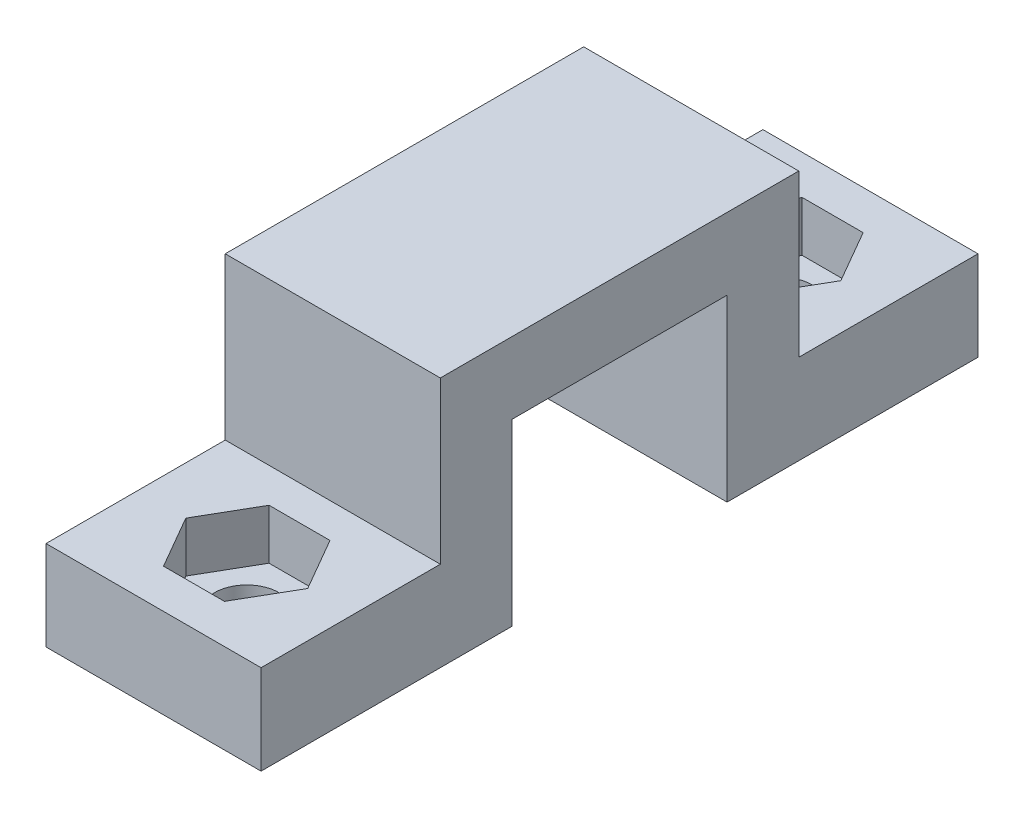
ISO-10303-21;
HEADER;
FILE_DESCRIPTION(('STEP AP214'),'2;1');
FILE_NAME('part.step','',(''),(''),'','','');
FILE_SCHEMA(('AUTOMOTIVE_DESIGN { 1 0 10303 214 1 1 1 1 }'));
ENDSEC;
DATA;
#1=APPLICATION_CONTEXT('core data for automotive mechanical design processes');
#2=APPLICATION_PROTOCOL_DEFINITION('international standard','automotive_design',2000,#1);
#3=PRODUCT_CONTEXT('',#1,'mechanical');
#4=PRODUCT('Part','Part','',(#3));
#5=PRODUCT_RELATED_PRODUCT_CATEGORY('part','',(#4));
#6=PRODUCT_DEFINITION_FORMATION('','',#4);
#7=PRODUCT_DEFINITION_CONTEXT('part definition',#1,'design');
#8=PRODUCT_DEFINITION('design','',#6,#7);
#9=PRODUCT_DEFINITION_SHAPE('','',#8);
#10=(LENGTH_UNIT() NAMED_UNIT(*) SI_UNIT(.MILLI.,.METRE.));
#11=(NAMED_UNIT(*) PLANE_ANGLE_UNIT() SI_UNIT($,.RADIAN.));
#12=(NAMED_UNIT(*) SI_UNIT($,.STERADIAN.) SOLID_ANGLE_UNIT());
#13=UNCERTAINTY_MEASURE_WITH_UNIT(LENGTH_MEASURE(1.E-05),#10,'distance_accuracy_value','');
#14=(GEOMETRIC_REPRESENTATION_CONTEXT(3) GLOBAL_UNCERTAINTY_ASSIGNED_CONTEXT((#13)) GLOBAL_UNIT_ASSIGNED_CONTEXT((#10,
#11,#12)) REPRESENTATION_CONTEXT('',''));
#15=CARTESIAN_POINT('',(0.,0.,0.));
#16=DIRECTION('',(0.,0.,1.));
#17=DIRECTION('',(1.,0.,0.));
#18=AXIS2_PLACEMENT_3D('',#15,#16,#17);
#19=CARTESIAN_POINT('',(0.0735964008141648,0.,14.8725279945104));
#20=DIRECTION('',(0.,1.,0.));
#21=DIRECTION('',(-1.,0.,0.));
#22=AXIS2_PLACEMENT_3D('',#19,#20,#21);
#23=CYLINDRICAL_SURFACE('',#22,1.8);
#24=CARTESIAN_POINT('',(0.0735964008141648,0.,14.8725279945104));
#25=DIRECTION('',(0.,1.,0.));
#26=DIRECTION('',(-1.,0.,0.));
#27=AXIS2_PLACEMENT_3D('',#24,#25,#26);
#28=CIRCLE('',#27,1.8);
#29=CARTESIAN_POINT('',(-1.72640359918583,0.,14.8725279945104));
#30=VERTEX_POINT('',#29);
#31=EDGE_CURVE('E287',#30,#30,#28,.F.);
#32=ORIENTED_EDGE('',*,*,#31,.T.);
#33=EDGE_LOOP('',(#32));
#34=FACE_BOUND('',#33,.T.);
#35=CARTESIAN_POINT('',(0.0735964008141644,2.2,14.8725279945104));
#36=DIRECTION('',(0.,1.,0.));
#37=DIRECTION('',(-1.,0.,0.));
#38=AXIS2_PLACEMENT_3D('',#35,#36,#37);
#39=CIRCLE('',#38,1.8);
#40=CARTESIAN_POINT('',(-1.72640359918584,2.2,14.8725279945104));
#41=VERTEX_POINT('',#40);
#42=EDGE_CURVE('E216',#41,#41,#39,.F.);
#43=ORIENTED_EDGE('',*,*,#42,.F.);
#44=EDGE_LOOP('',(#43));
#45=FACE_BOUND('',#44,.T.);
#46=ADVANCED_FACE('F32',(#34,#45),#23,.F.);
#47=CARTESIAN_POINT('',(6.,5.,-20.));
#48=DIRECTION('',(0.,1.,0.));
#49=DIRECTION('',(-1.,0.,0.));
#50=AXIS2_PLACEMENT_3D('',#47,#48,#49);
#51=PLANE('',#50);
#52=DIRECTION('',(-1.,0.,0.));
#53=VECTOR('',#52,1.);
#54=CARTESIAN_POINT('',(6.,5.,-10.));
#55=LINE('',#54,#53);
#56=CARTESIAN_POINT('',(6.,5.,-10.));
#57=VERTEX_POINT('',#56);
#58=CARTESIAN_POINT('',(-6.,5.,-10.));
#59=VERTEX_POINT('',#58);
#60=EDGE_CURVE('E335',#57,#59,#55,.T.);
#61=ORIENTED_EDGE('',*,*,#60,.F.);
#62=DIRECTION('',(0.,0.,1.));
#63=VECTOR('',#62,1.);
#64=CARTESIAN_POINT('',(6.,5.,-20.));
#65=LINE('',#64,#63);
#66=CARTESIAN_POINT('',(6.,5.,-20.));
#67=VERTEX_POINT('',#66);
#68=EDGE_CURVE('E337',#67,#57,#65,.T.);
#69=ORIENTED_EDGE('',*,*,#68,.F.);
#70=DIRECTION('',(-1.,0.,0.));
#71=VECTOR('',#70,1.);
#72=CARTESIAN_POINT('',(6.,5.,-20.));
#73=LINE('',#72,#71);
#74=CARTESIAN_POINT('',(-6.,5.,-20.));
#75=VERTEX_POINT('',#74);
#76=EDGE_CURVE('E323',#67,#75,#73,.T.);
#77=ORIENTED_EDGE('',*,*,#76,.T.);
#78=DIRECTION('',(0.,0.,1.));
#79=VECTOR('',#78,1.);
#80=CARTESIAN_POINT('',(-6.,5.,-20.));
#81=LINE('',#80,#79);
#82=EDGE_CURVE('E333',#75,#59,#81,.T.);
#83=ORIENTED_EDGE('',*,*,#82,.T.);
#84=EDGE_LOOP('',(#61,#69,#77,#83));
#85=FACE_BOUND('',#84,.T.);
#86=DIRECTION('',(-0.500000000000004,0.,0.866025403784436));
#87=VECTOR('',#86,1.);
#88=CARTESIAN_POINT('',(-3.83479623026002,5.,-2.21402063582801));
#89=LINE('',#88,#87);
#90=CARTESIAN_POINT('',(3.47359640081417,5.,-14.8725279945104));
#91=VERTEX_POINT('',#90);
#92=CARTESIAN_POINT('',(1.77359640081416,5.,-11.9280416216433));
#93=VERTEX_POINT('',#92);
#94=EDGE_CURVE('E271',#91,#93,#89,.T.);
#95=ORIENTED_EDGE('',*,*,#94,.T.);
#96=DIRECTION('',(-1.,0.,0.));
#97=VECTOR('',#96,1.);
#98=CARTESIAN_POINT('',(0.,5.,-11.9280416216433));
#99=LINE('',#98,#97);
#100=CARTESIAN_POINT('',(-1.62640359918585,5.,-11.9280416216433));
#101=VERTEX_POINT('',#100);
#102=EDGE_CURVE('E55',#93,#101,#99,.T.);
#103=ORIENTED_EDGE('',*,*,#102,.T.);
#104=DIRECTION('',(-0.499999999999998,0.,-0.86602540378444));
#105=VECTOR('',#104,1.);
#106=CARTESIAN_POINT('',(3.9451908314812,5.,-2.27775698856011));
#107=LINE('',#106,#105);
#108=CARTESIAN_POINT('',(-3.32640359918584,5.,-14.8725279945104));
#109=VERTEX_POINT('',#108);
#110=EDGE_CURVE('E256',#101,#109,#107,.T.);
#111=ORIENTED_EDGE('',*,*,#110,.T.);
#112=DIRECTION('',(0.500000000000004,0.,-0.866025403784437));
#113=VECTOR('',#112,1.);
#114=CARTESIAN_POINT('',(-8.93479623026,5.,-5.15850700869512));
#115=LINE('',#114,#113);
#116=CARTESIAN_POINT('',(-1.62640359918582,5.,-17.8170143673775));
#117=VERTEX_POINT('',#116);
#118=EDGE_CURVE('E280',#109,#117,#115,.T.);
#119=ORIENTED_EDGE('',*,*,#118,.T.);
#120=DIRECTION('',(1.,0.,0.));
#121=VECTOR('',#120,1.);
#122=CARTESIAN_POINT('',(0.,5.,-17.8170143673775));
#123=LINE('',#122,#121);
#124=CARTESIAN_POINT('',(1.77359640081418,5.,-17.8170143673775));
#125=VERTEX_POINT('',#124);
#126=EDGE_CURVE('E277',#117,#125,#123,.T.);
#127=ORIENTED_EDGE('',*,*,#126,.T.);
#128=DIRECTION('',(0.499999999999998,0.,0.86602540378444));
#129=VECTOR('',#128,1.);
#130=CARTESIAN_POINT('',(9.04519083148122,5.,-5.22224336142719));
#131=LINE('',#130,#129);
#132=EDGE_CURVE('E274',#125,#91,#131,.T.);
#133=ORIENTED_EDGE('',*,*,#132,.T.);
#134=EDGE_LOOP('',(#95,#103,#111,#119,#127,#133));
#135=FACE_BOUND('',#134,.T.);
#136=ADVANCED_FACE('F432',(#85,#135),#51,.T.);
#137=CARTESIAN_POINT('',(0.0735964008141648,0.,-14.8725279945104));
#138=DIRECTION('',(0.,1.,0.));
#139=DIRECTION('',(-1.,0.,0.));
#140=AXIS2_PLACEMENT_3D('',#137,#138,#139);
#141=CYLINDRICAL_SURFACE('',#140,1.8);
#142=CARTESIAN_POINT('',(0.0735964008141648,0.,-14.8725279945104));
#143=DIRECTION('',(0.,1.,0.));
#144=DIRECTION('',(-1.,0.,0.));
#145=AXIS2_PLACEMENT_3D('',#142,#143,#144);
#146=CIRCLE('',#145,1.8);
#147=CARTESIAN_POINT('',(-1.72640359918583,0.,-14.8725279945104));
#148=VERTEX_POINT('',#147);
#149=EDGE_CURVE('E299',#148,#148,#146,.T.);
#150=ORIENTED_EDGE('',*,*,#149,.F.);
#151=EDGE_LOOP('',(#150));
#152=FACE_BOUND('',#151,.T.);
#153=CARTESIAN_POINT('',(0.0735964008141644,2.2,-14.8725279945104));
#154=DIRECTION('',(0.,1.,0.));
#155=DIRECTION('',(-1.,0.,0.));
#156=AXIS2_PLACEMENT_3D('',#153,#154,#155);
#157=CIRCLE('',#156,1.8);
#158=CARTESIAN_POINT('',(-1.72640359918584,2.2,-14.8725279945104));
#159=VERTEX_POINT('',#158);
#160=EDGE_CURVE('E266',#159,#159,#157,.T.);
#161=ORIENTED_EDGE('',*,*,#160,.T.);
#162=EDGE_LOOP('',(#161));
#163=FACE_BOUND('',#162,.T.);
#164=ADVANCED_FACE('F458',(#152,#163),#141,.F.);
#165=CARTESIAN_POINT('',(0.,0.,0.));
#166=DIRECTION('',(0.,1.,0.));
#167=DIRECTION('',(0.,0.,1.));
#168=AXIS2_PLACEMENT_3D('',#165,#166,#167);
#169=PLANE('',#168);
#170=ORIENTED_EDGE('',*,*,#31,.F.);
#171=EDGE_LOOP('',(#170));
#172=FACE_BOUND('',#171,.T.);
#173=DIRECTION('',(0.,0.,1.));
#174=VECTOR('',#173,1.);
#175=CARTESIAN_POINT('',(-6.,0.,10.));
#176=LINE('',#175,#174);
#177=CARTESIAN_POINT('',(-6.,0.,6.00000000000011));
#178=VERTEX_POINT('',#177);
#179=CARTESIAN_POINT('',(-6.00000000000011,0.,20.));
#180=VERTEX_POINT('',#179);
#181=EDGE_CURVE('E362',#178,#180,#176,.T.);
#182=ORIENTED_EDGE('',*,*,#181,.F.);
#183=DIRECTION('',(1.,0.,0.));
#184=VECTOR('',#183,1.);
#185=CARTESIAN_POINT('',(-6.,0.,6.00000000000011));
#186=LINE('',#185,#184);
#187=CARTESIAN_POINT('',(6.,0.,6.00000000000011));
#188=VERTEX_POINT('',#187);
#189=EDGE_CURVE('E302',#178,#188,#186,.T.);
#190=ORIENTED_EDGE('',*,*,#189,.T.);
#191=DIRECTION('',(0.,0.,-1.));
#192=VECTOR('',#191,1.);
#193=CARTESIAN_POINT('',(6.,0.,10.));
#194=LINE('',#193,#192);
#195=CARTESIAN_POINT('',(6.,0.,20.));
#196=VERTEX_POINT('',#195);
#197=EDGE_CURVE('E369',#196,#188,#194,.T.);
#198=ORIENTED_EDGE('',*,*,#197,.F.);
#199=DIRECTION('',(1.,0.,0.));
#200=VECTOR('',#199,1.);
#201=CARTESIAN_POINT('',(6.,0.,20.));
#202=LINE('',#201,#200);
#203=EDGE_CURVE('E317',#180,#196,#202,.T.);
#204=ORIENTED_EDGE('',*,*,#203,.F.);
#205=EDGE_LOOP('',(#182,#190,#198,#204));
#206=FACE_BOUND('',#205,.T.);
#207=ADVANCED_FACE('F408',(#172,#206),#169,.F.);
#208=CARTESIAN_POINT('',(-6.,14.,10.));
#209=DIRECTION('',(1.,0.,0.));
#210=DIRECTION('',(0.,0.,-1.));
#211=AXIS2_PLACEMENT_3D('',#208,#209,#210);
#212=PLANE('',#211);
#213=DIRECTION('',(0.,-1.,0.));
#214=VECTOR('',#213,1.);
#215=CARTESIAN_POINT('',(-6.,9.99999999999545,6.00000000000011));
#216=LINE('',#215,#214);
#217=CARTESIAN_POINT('',(-6.,9.99999999999545,6.00000000000011));
#218=VERTEX_POINT('',#217);
#219=EDGE_CURVE('E346',#218,#178,#216,.T.);
#220=ORIENTED_EDGE('',*,*,#219,.T.);
#221=ORIENTED_EDGE('',*,*,#181,.T.);
#222=DIRECTION('',(0.,-1.,0.));
#223=VECTOR('',#222,1.);
#224=CARTESIAN_POINT('',(-6.00000000000011,0.,20.));
#225=LINE('',#224,#223);
#226=CARTESIAN_POINT('',(-6.,5.,20.));
#227=VERTEX_POINT('',#226);
#228=EDGE_CURVE('E314',#227,#180,#225,.T.);
#229=ORIENTED_EDGE('',*,*,#228,.F.);
#230=CARTESIAN_POINT('',(-6.,5.,10.));
#231=VERTEX_POINT('',#230);
#232=EDGE_CURVE('E336',#231,#227,#81,.T.);
#233=ORIENTED_EDGE('',*,*,#232,.F.);
#234=DIRECTION('',(0.,-1.,0.));
#235=VECTOR('',#234,1.);
#236=CARTESIAN_POINT('',(-6.,14.,10.));
#237=LINE('',#236,#235);
#238=CARTESIAN_POINT('',(-6.,14.,10.));
#239=VERTEX_POINT('',#238);
#240=EDGE_CURVE('E11',#239,#231,#237,.T.);
#241=ORIENTED_EDGE('',*,*,#240,.F.);
#242=DIRECTION('',(0.,0.,1.));
#243=VECTOR('',#242,1.);
#244=CARTESIAN_POINT('',(-6.,14.,10.));
#245=LINE('',#244,#243);
#246=CARTESIAN_POINT('',(-6.,14.,-10.));
#247=VERTEX_POINT('',#246);
#248=EDGE_CURVE('E365',#247,#239,#245,.T.);
#249=ORIENTED_EDGE('',*,*,#248,.F.);
#250=DIRECTION('',(0.,-1.,0.));
#251=VECTOR('',#250,1.);
#252=CARTESIAN_POINT('',(-6.,14.,-10.));
#253=LINE('',#252,#251);
#254=EDGE_CURVE('E375',#247,#59,#253,.T.);
#255=ORIENTED_EDGE('',*,*,#254,.T.);
#256=ORIENTED_EDGE('',*,*,#82,.F.);
#257=DIRECTION('',(0.,-1.,0.));
#258=VECTOR('',#257,1.);
#259=CARTESIAN_POINT('',(-6.00000000000011,0.,-20.));
#260=LINE('',#259,#258);
#261=CARTESIAN_POINT('',(-6.00000000000011,0.,-20.));
#262=VERTEX_POINT('',#261);
#263=EDGE_CURVE('E326',#75,#262,#260,.T.);
#264=ORIENTED_EDGE('',*,*,#263,.T.);
#265=CARTESIAN_POINT('',(-6.,0.,-6.00000000000001));
#266=VERTEX_POINT('',#265);
#267=EDGE_CURVE('E376',#262,#266,#176,.T.);
#268=ORIENTED_EDGE('',*,*,#267,.T.);
#269=DIRECTION('',(0.,1.,0.));
#270=VECTOR('',#269,1.);
#271=CARTESIAN_POINT('',(-6.,9.99999999999545,-6.00000000000001));
#272=LINE('',#271,#270);
#273=CARTESIAN_POINT('',(-6.,9.99999999999545,-6.00000000000001));
#274=VERTEX_POINT('',#273);
#275=EDGE_CURVE('E348',#266,#274,#272,.T.);
#276=ORIENTED_EDGE('',*,*,#275,.T.);
#277=DIRECTION('',(0.,0.,1.));
#278=VECTOR('',#277,1.);
#279=CARTESIAN_POINT('',(-6.,9.99999999999545,6.00000000000011));
#280=LINE('',#279,#278);
#281=EDGE_CURVE('E351',#274,#218,#280,.T.);
#282=ORIENTED_EDGE('',*,*,#281,.T.);
#283=EDGE_LOOP('',(#220,#221,#229,#233,#241,#249,#255,#256,#264,#268,#276,#282));
#284=FACE_BOUND('',#283,.T.);
#285=ADVANCED_FACE('F34',(#284),#212,.F.);
#286=CARTESIAN_POINT('',(6.,14.,10.));
#287=DIRECTION('',(0.,0.,-1.));
#288=DIRECTION('',(-1.,0.,0.));
#289=AXIS2_PLACEMENT_3D('',#286,#287,#288);
#290=PLANE('',#289);
#291=ORIENTED_EDGE('',*,*,#240,.T.);
#292=DIRECTION('',(1.,0.,0.));
#293=VECTOR('',#292,1.);
#294=CARTESIAN_POINT('',(6.,5.,10.));
#295=LINE('',#294,#293);
#296=CARTESIAN_POINT('',(6.,5.,10.));
#297=VERTEX_POINT('',#296);
#298=EDGE_CURVE('E342',#231,#297,#295,.T.);
#299=ORIENTED_EDGE('',*,*,#298,.T.);
#300=DIRECTION('',(0.,-1.,0.));
#301=VECTOR('',#300,1.);
#302=CARTESIAN_POINT('',(6.,14.,10.));
#303=LINE('',#302,#301);
#304=CARTESIAN_POINT('',(6.,14.,10.));
#305=VERTEX_POINT('',#304);
#306=EDGE_CURVE('E40',#305,#297,#303,.T.);
#307=ORIENTED_EDGE('',*,*,#306,.F.);
#308=DIRECTION('',(1.,0.,0.));
#309=VECTOR('',#308,1.);
#310=CARTESIAN_POINT('',(6.,14.,10.));
#311=LINE('',#310,#309);
#312=EDGE_CURVE('E368',#239,#305,#311,.T.);
#313=ORIENTED_EDGE('',*,*,#312,.F.);
#314=EDGE_LOOP('',(#291,#299,#307,#313));
#315=FACE_BOUND('',#314,.T.);
#316=ADVANCED_FACE('F395',(#315),#290,.F.);
#317=CARTESIAN_POINT('',(6.,14.,10.));
#318=DIRECTION('',(-1.,0.,0.));
#319=DIRECTION('',(0.,0.,1.));
#320=AXIS2_PLACEMENT_3D('',#317,#318,#319);
#321=PLANE('',#320);
#322=ORIENTED_EDGE('',*,*,#197,.T.);
#323=DIRECTION('',(0.,-1.,0.));
#324=VECTOR('',#323,1.);
#325=CARTESIAN_POINT('',(6.,9.99999999999545,6.00000000000011));
#326=LINE('',#325,#324);
#327=CARTESIAN_POINT('',(6.,9.99999999999545,6.00000000000011));
#328=VERTEX_POINT('',#327);
#329=EDGE_CURVE('E345',#328,#188,#326,.T.);
#330=ORIENTED_EDGE('',*,*,#329,.F.);
#331=DIRECTION('',(0.,0.,1.));
#332=VECTOR('',#331,1.);
#333=CARTESIAN_POINT('',(6.,9.99999999999545,6.00000000000011));
#334=LINE('',#333,#332);
#335=CARTESIAN_POINT('',(6.,9.99999999999545,-6.00000000000001));
#336=VERTEX_POINT('',#335);
#337=EDGE_CURVE('E349',#336,#328,#334,.T.);
#338=ORIENTED_EDGE('',*,*,#337,.F.);
#339=DIRECTION('',(0.,1.,0.));
#340=VECTOR('',#339,1.);
#341=CARTESIAN_POINT('',(6.,9.99999999999545,-6.00000000000001));
#342=LINE('',#341,#340);
#343=CARTESIAN_POINT('',(6.,0.,-6.00000000000001));
#344=VERTEX_POINT('',#343);
#345=EDGE_CURVE('E356',#344,#336,#342,.T.);
#346=ORIENTED_EDGE('',*,*,#345,.F.);
#347=CARTESIAN_POINT('',(6.,0.,-20.));
#348=VERTEX_POINT('',#347);
#349=EDGE_CURVE('E379',#344,#348,#194,.T.);
#350=ORIENTED_EDGE('',*,*,#349,.T.);
#351=DIRECTION('',(0.,1.,0.));
#352=VECTOR('',#351,1.);
#353=CARTESIAN_POINT('',(6.,0.,-20.));
#354=LINE('',#353,#352);
#355=EDGE_CURVE('E320',#348,#67,#354,.T.);
#356=ORIENTED_EDGE('',*,*,#355,.T.);
#357=ORIENTED_EDGE('',*,*,#68,.T.);
#358=DIRECTION('',(0.,-1.,0.));
#359=VECTOR('',#358,1.);
#360=CARTESIAN_POINT('',(6.,14.,-10.));
#361=LINE('',#360,#359);
#362=CARTESIAN_POINT('',(6.,14.,-10.));
#363=VERTEX_POINT('',#362);
#364=EDGE_CURVE('E384',#363,#57,#361,.T.);
#365=ORIENTED_EDGE('',*,*,#364,.F.);
#366=DIRECTION('',(0.,0.,-1.));
#367=VECTOR('',#366,1.);
#368=CARTESIAN_POINT('',(6.,14.,10.));
#369=LINE('',#368,#367);
#370=EDGE_CURVE('E371',#305,#363,#369,.T.);
#371=ORIENTED_EDGE('',*,*,#370,.F.);
#372=ORIENTED_EDGE('',*,*,#306,.T.);
#373=CARTESIAN_POINT('',(6.,5.,20.));
#374=VERTEX_POINT('',#373);
#375=EDGE_CURVE('E332',#297,#374,#65,.T.);
#376=ORIENTED_EDGE('',*,*,#375,.T.);
#377=DIRECTION('',(0.,1.,0.));
#378=VECTOR('',#377,1.);
#379=CARTESIAN_POINT('',(6.,0.,20.));
#380=LINE('',#379,#378);
#381=EDGE_CURVE('E306',#196,#374,#380,.T.);
#382=ORIENTED_EDGE('',*,*,#381,.F.);
#383=EDGE_LOOP('',(#322,#330,#338,#346,#350,#356,#357,#365,#371,#372,#376,#382));
#384=FACE_BOUND('',#383,.T.);
#385=ADVANCED_FACE('F390',(#384),#321,.F.);
#386=CARTESIAN_POINT('',(6.,14.,-10.));
#387=DIRECTION('',(0.,0.,1.));
#388=DIRECTION('',(1.,0.,0.));
#389=AXIS2_PLACEMENT_3D('',#386,#387,#388);
#390=PLANE('',#389);
#391=ORIENTED_EDGE('',*,*,#364,.T.);
#392=ORIENTED_EDGE('',*,*,#60,.T.);
#393=ORIENTED_EDGE('',*,*,#254,.F.);
#394=DIRECTION('',(-1.,0.,0.));
#395=VECTOR('',#394,1.);
#396=CARTESIAN_POINT('',(6.,14.,-10.));
#397=LINE('',#396,#395);
#398=EDGE_CURVE('E373',#363,#247,#397,.T.);
#399=ORIENTED_EDGE('',*,*,#398,.F.);
#400=EDGE_LOOP('',(#391,#392,#393,#399));
#401=FACE_BOUND('',#400,.T.);
#402=ADVANCED_FACE('F436',(#401),#390,.F.);
#403=CARTESIAN_POINT('',(0.,14.,0.));
#404=DIRECTION('',(0.,1.,0.));
#405=DIRECTION('',(0.,0.,1.));
#406=AXIS2_PLACEMENT_3D('',#403,#404,#405);
#407=PLANE('',#406);
#408=ORIENTED_EDGE('',*,*,#248,.T.);
#409=ORIENTED_EDGE('',*,*,#312,.T.);
#410=ORIENTED_EDGE('',*,*,#370,.T.);
#411=ORIENTED_EDGE('',*,*,#398,.T.);
#412=EDGE_LOOP('',(#408,#409,#410,#411));
#413=FACE_BOUND('',#412,.T.);
#414=ADVANCED_FACE('F439',(#413),#407,.T.);
#415=ORIENTED_EDGE('',*,*,#149,.T.);
#416=EDGE_LOOP('',(#415));
#417=FACE_BOUND('',#416,.T.);
#418=ORIENTED_EDGE('',*,*,#349,.F.);
#419=DIRECTION('',(1.,0.,0.));
#420=VECTOR('',#419,1.);
#421=CARTESIAN_POINT('',(-6.,0.,-6.00000000000001));
#422=LINE('',#421,#420);
#423=EDGE_CURVE('E303',#266,#344,#422,.T.);
#424=ORIENTED_EDGE('',*,*,#423,.F.);
#425=ORIENTED_EDGE('',*,*,#267,.F.);
#426=DIRECTION('',(1.,0.,0.));
#427=VECTOR('',#426,1.);
#428=CARTESIAN_POINT('',(6.,0.,-20.));
#429=LINE('',#428,#427);
#430=EDGE_CURVE('E329',#262,#348,#429,.T.);
#431=ORIENTED_EDGE('',*,*,#430,.T.);
#432=EDGE_LOOP('',(#418,#424,#425,#431));
#433=FACE_BOUND('',#432,.T.);
#434=ADVANCED_FACE('F430',(#417,#433),#169,.F.);
#435=CARTESIAN_POINT('',(-6.,9.99999999999545,6.00000000000011));
#436=DIRECTION('',(0.,0.,1.));
#437=DIRECTION('',(1.,0.,0.));
#438=AXIS2_PLACEMENT_3D('',#435,#436,#437);
#439=PLANE('',#438);
#440=ORIENTED_EDGE('',*,*,#329,.T.);
#441=ORIENTED_EDGE('',*,*,#189,.F.);
#442=ORIENTED_EDGE('',*,*,#219,.F.);
#443=DIRECTION('',(1.,0.,0.));
#444=VECTOR('',#443,1.);
#445=CARTESIAN_POINT('',(-6.,9.99999999999545,6.00000000000011));
#446=LINE('',#445,#444);
#447=EDGE_CURVE('E360',#218,#328,#446,.T.);
#448=ORIENTED_EDGE('',*,*,#447,.T.);
#449=EDGE_LOOP('',(#440,#441,#442,#448));
#450=FACE_BOUND('',#449,.T.);
#451=ADVANCED_FACE('F413',(#450),#439,.F.);
#452=CARTESIAN_POINT('',(-6.,9.99999999999545,6.00000000000011));
#453=DIRECTION('',(0.,1.,0.));
#454=DIRECTION('',(0.,0.,1.));
#455=AXIS2_PLACEMENT_3D('',#452,#453,#454);
#456=PLANE('',#455);
#457=ORIENTED_EDGE('',*,*,#337,.T.);
#458=ORIENTED_EDGE('',*,*,#447,.F.);
#459=ORIENTED_EDGE('',*,*,#281,.F.);
#460=DIRECTION('',(1.,0.,0.));
#461=VECTOR('',#460,1.);
#462=CARTESIAN_POINT('',(-6.,9.99999999999545,-6.00000000000001));
#463=LINE('',#462,#461);
#464=EDGE_CURVE('E354',#274,#336,#463,.T.);
#465=ORIENTED_EDGE('',*,*,#464,.T.);
#466=EDGE_LOOP('',(#457,#458,#459,#465));
#467=FACE_BOUND('',#466,.T.);
#468=ADVANCED_FACE('F417',(#467),#456,.F.);
#469=CARTESIAN_POINT('',(-6.,9.99999999999545,-6.00000000000001));
#470=DIRECTION('',(0.,0.,-1.));
#471=DIRECTION('',(-1.,0.,0.));
#472=AXIS2_PLACEMENT_3D('',#469,#470,#471);
#473=PLANE('',#472);
#474=ORIENTED_EDGE('',*,*,#275,.F.);
#475=ORIENTED_EDGE('',*,*,#423,.T.);
#476=ORIENTED_EDGE('',*,*,#345,.T.);
#477=ORIENTED_EDGE('',*,*,#464,.F.);
#478=EDGE_LOOP('',(#474,#475,#476,#477));
#479=FACE_BOUND('',#478,.T.);
#480=ADVANCED_FACE('F420',(#479),#473,.F.);
#481=CARTESIAN_POINT('',(0.,0.,-20.));
#482=DIRECTION('',(0.,0.,1.));
#483=DIRECTION('',(1.,0.,0.));
#484=AXIS2_PLACEMENT_3D('',#481,#482,#483);
#485=PLANE('',#484);
#486=ORIENTED_EDGE('',*,*,#355,.F.);
#487=ORIENTED_EDGE('',*,*,#430,.F.);
#488=ORIENTED_EDGE('',*,*,#263,.F.);
#489=ORIENTED_EDGE('',*,*,#76,.F.);
#490=EDGE_LOOP('',(#486,#487,#488,#489));
#491=FACE_BOUND('',#490,.T.);
#492=ADVANCED_FACE('F428',(#491),#485,.F.);
#493=DIRECTION('',(0.500000000000003,0.,0.866025403784437));
#494=VECTOR('',#493,1.);
#495=CARTESIAN_POINT('',(-8.93479623026,5.,5.15850700869511));
#496=LINE('',#495,#494);
#497=CARTESIAN_POINT('',(-3.32640359918584,5.,14.8725279945104));
#498=VERTEX_POINT('',#497);
#499=CARTESIAN_POINT('',(-1.62640359918583,5.,17.8170143673775));
#500=VERTEX_POINT('',#499);
#501=EDGE_CURVE('E47',#498,#500,#496,.T.);
#502=ORIENTED_EDGE('',*,*,#501,.F.);
#503=DIRECTION('',(-0.499999999999998,0.,0.86602540378444));
#504=VECTOR('',#503,1.);
#505=CARTESIAN_POINT('',(3.9451908314812,5.,2.27775698856011));
#506=LINE('',#505,#504);
#507=CARTESIAN_POINT('',(-1.62640359918585,5.,11.9280416216433));
#508=VERTEX_POINT('',#507);
#509=EDGE_CURVE('E219',#508,#498,#506,.T.);
#510=ORIENTED_EDGE('',*,*,#509,.F.);
#511=DIRECTION('',(-1.,0.,0.));
#512=VECTOR('',#511,1.);
#513=CARTESIAN_POINT('',(0.,5.,11.9280416216433));
#514=LINE('',#513,#512);
#515=CARTESIAN_POINT('',(1.77359640081415,5.,11.9280416216433));
#516=VERTEX_POINT('',#515);
#517=EDGE_CURVE('E238',#516,#508,#514,.T.);
#518=ORIENTED_EDGE('',*,*,#517,.F.);
#519=DIRECTION('',(-0.500000000000004,0.,-0.866025403784436));
#520=VECTOR('',#519,1.);
#521=CARTESIAN_POINT('',(-3.83479623026003,5.,2.21402063582801));
#522=LINE('',#521,#520);
#523=CARTESIAN_POINT('',(3.47359640081417,5.,14.8725279945104));
#524=VERTEX_POINT('',#523);
#525=EDGE_CURVE('E235',#524,#516,#522,.T.);
#526=ORIENTED_EDGE('',*,*,#525,.F.);
#527=DIRECTION('',(0.499999999999998,0.,-0.86602540378444));
#528=VECTOR('',#527,1.);
#529=CARTESIAN_POINT('',(9.04519083148122,5.,5.22224336142719));
#530=LINE('',#529,#528);
#531=CARTESIAN_POINT('',(1.77359640081417,5.,17.8170143673775));
#532=VERTEX_POINT('',#531);
#533=EDGE_CURVE('E232',#532,#524,#530,.T.);
#534=ORIENTED_EDGE('',*,*,#533,.F.);
#535=DIRECTION('',(1.,0.,0.));
#536=VECTOR('',#535,1.);
#537=CARTESIAN_POINT('',(0.,5.,17.8170143673775));
#538=LINE('',#537,#536);
#539=EDGE_CURVE('E230',#500,#532,#538,.T.);
#540=ORIENTED_EDGE('',*,*,#539,.F.);
#541=EDGE_LOOP('',(#502,#510,#518,#526,#534,#540));
#542=FACE_BOUND('',#541,.T.);
#543=ORIENTED_EDGE('',*,*,#298,.F.);
#544=ORIENTED_EDGE('',*,*,#232,.T.);
#545=DIRECTION('',(-1.,0.,0.));
#546=VECTOR('',#545,1.);
#547=CARTESIAN_POINT('',(6.,5.,20.));
#548=LINE('',#547,#546);
#549=EDGE_CURVE('E311',#374,#227,#548,.T.);
#550=ORIENTED_EDGE('',*,*,#549,.F.);
#551=ORIENTED_EDGE('',*,*,#375,.F.);
#552=EDGE_LOOP('',(#543,#544,#550,#551));
#553=FACE_BOUND('',#552,.T.);
#554=ADVANCED_FACE('F399',(#542,#553),#51,.T.);
#555=CARTESIAN_POINT('',(0.,0.,20.));
#556=DIRECTION('',(0.,0.,1.));
#557=DIRECTION('',(1.,0.,0.));
#558=AXIS2_PLACEMENT_3D('',#555,#556,#557);
#559=PLANE('',#558);
#560=ORIENTED_EDGE('',*,*,#381,.T.);
#561=ORIENTED_EDGE('',*,*,#549,.T.);
#562=ORIENTED_EDGE('',*,*,#228,.T.);
#563=ORIENTED_EDGE('',*,*,#203,.T.);
#564=EDGE_LOOP('',(#560,#561,#562,#563));
#565=FACE_BOUND('',#564,.T.);
#566=ADVANCED_FACE('F406',(#565),#559,.T.);
#567=CARTESIAN_POINT('',(0.,2.2,-11.9280416216433));
#568=DIRECTION('',(0.,0.,-1.));
#569=DIRECTION('',(-1.,0.,0.));
#570=AXIS2_PLACEMENT_3D('',#567,#568,#569);
#571=PLANE('',#570);
#572=ORIENTED_EDGE('',*,*,#102,.F.);
#573=DIRECTION('',(0.,1.,0.));
#574=VECTOR('',#573,1.);
#575=CARTESIAN_POINT('',(1.77359640081416,2.2,-11.9280416216433));
#576=LINE('',#575,#574);
#577=CARTESIAN_POINT('',(1.77359640081416,2.2,-11.9280416216433));
#578=VERTEX_POINT('',#577);
#579=EDGE_CURVE('E269',#578,#93,#576,.T.);
#580=ORIENTED_EDGE('',*,*,#579,.F.);
#581=DIRECTION('',(-1.,0.,0.));
#582=VECTOR('',#581,1.);
#583=CARTESIAN_POINT('',(0.,2.2,-11.9280416216433));
#584=LINE('',#583,#582);
#585=CARTESIAN_POINT('',(-1.62640359918584,2.2,-11.9280416216433));
#586=VERTEX_POINT('',#585);
#587=EDGE_CURVE('E252',#578,#586,#584,.T.);
#588=ORIENTED_EDGE('',*,*,#587,.T.);
#589=DIRECTION('',(0.,1.,0.));
#590=VECTOR('',#589,1.);
#591=CARTESIAN_POINT('',(-1.62640359918584,2.2,-11.9280416216433));
#592=LINE('',#591,#590);
#593=EDGE_CURVE('E285',#586,#101,#592,.T.);
#594=ORIENTED_EDGE('',*,*,#593,.T.);
#595=EDGE_LOOP('',(#572,#580,#588,#594));
#596=FACE_BOUND('',#595,.T.);
#597=ADVANCED_FACE('F463',(#596),#571,.T.);
#598=CARTESIAN_POINT('',(3.94519083148121,2.2,-2.27775698856011));
#599=DIRECTION('',(0.86602540378444,0.,-0.499999999999998));
#600=DIRECTION('',(-0.499999999999998,0.,-0.86602540378444));
#601=AXIS2_PLACEMENT_3D('',#598,#599,#600);
#602=PLANE('',#601);
#603=ORIENTED_EDGE('',*,*,#110,.F.);
#604=ORIENTED_EDGE('',*,*,#593,.F.);
#605=DIRECTION('',(-0.499999999999998,0.,-0.86602540378444));
#606=VECTOR('',#605,1.);
#607=CARTESIAN_POINT('',(3.94519083148121,2.2,-2.27775698856011));
#608=LINE('',#607,#606);
#609=CARTESIAN_POINT('',(-3.32640359918584,2.2,-14.8725279945104));
#610=VERTEX_POINT('',#609);
#611=EDGE_CURVE('E264',#586,#610,#608,.T.);
#612=ORIENTED_EDGE('',*,*,#611,.T.);
#613=DIRECTION('',(0.,1.,0.));
#614=VECTOR('',#613,1.);
#615=CARTESIAN_POINT('',(-3.32640359918584,2.2,-14.8725279945104));
#616=LINE('',#615,#614);
#617=EDGE_CURVE('E288',#610,#109,#616,.T.);
#618=ORIENTED_EDGE('',*,*,#617,.T.);
#619=EDGE_LOOP('',(#603,#604,#612,#618));
#620=FACE_BOUND('',#619,.T.);
#621=ADVANCED_FACE('F507',(#620),#602,.T.);
#622=CARTESIAN_POINT('',(-8.93479623026,2.2,-5.15850700869512));
#623=DIRECTION('',(0.866025403784436,0.,0.500000000000004));
#624=DIRECTION('',(0.500000000000004,0.,-0.866025403784436));
#625=AXIS2_PLACEMENT_3D('',#622,#623,#624);
#626=PLANE('',#625);
#627=ORIENTED_EDGE('',*,*,#118,.F.);
#628=ORIENTED_EDGE('',*,*,#617,.F.);
#629=DIRECTION('',(0.500000000000004,0.,-0.866025403784437));
#630=VECTOR('',#629,1.);
#631=CARTESIAN_POINT('',(-8.93479623026,2.2,-5.15850700869512));
#632=LINE('',#631,#630);
#633=CARTESIAN_POINT('',(-1.62640359918582,2.2,-17.8170143673775));
#634=VERTEX_POINT('',#633);
#635=EDGE_CURVE('E262',#610,#634,#632,.T.);
#636=ORIENTED_EDGE('',*,*,#635,.T.);
#637=DIRECTION('',(0.,1.,0.));
#638=VECTOR('',#637,1.);
#639=CARTESIAN_POINT('',(-1.62640359918582,2.2,-17.8170143673775));
#640=LINE('',#639,#638);
#641=EDGE_CURVE('E290',#634,#117,#640,.T.);
#642=ORIENTED_EDGE('',*,*,#641,.T.);
#643=EDGE_LOOP('',(#627,#628,#636,#642));
#644=FACE_BOUND('',#643,.T.);
#645=ADVANCED_FACE('F513',(#644),#626,.T.);
#646=CARTESIAN_POINT('',(0.,2.2,-17.8170143673775));
#647=DIRECTION('',(0.,0.,1.));
#648=DIRECTION('',(1.,0.,0.));
#649=AXIS2_PLACEMENT_3D('',#646,#647,#648);
#650=PLANE('',#649);
#651=ORIENTED_EDGE('',*,*,#126,.F.);
#652=ORIENTED_EDGE('',*,*,#641,.F.);
#653=DIRECTION('',(1.,0.,0.));
#654=VECTOR('',#653,1.);
#655=CARTESIAN_POINT('',(0.,2.2,-17.8170143673775));
#656=LINE('',#655,#654);
#657=CARTESIAN_POINT('',(1.77359640081418,2.2,-17.8170143673775));
#658=VERTEX_POINT('',#657);
#659=EDGE_CURVE('E260',#634,#658,#656,.T.);
#660=ORIENTED_EDGE('',*,*,#659,.T.);
#661=DIRECTION('',(0.,1.,0.));
#662=VECTOR('',#661,1.);
#663=CARTESIAN_POINT('',(1.77359640081418,2.2,-17.8170143673775));
#664=LINE('',#663,#662);
#665=EDGE_CURVE('E292',#658,#125,#664,.T.);
#666=ORIENTED_EDGE('',*,*,#665,.T.);
#667=EDGE_LOOP('',(#651,#652,#660,#666));
#668=FACE_BOUND('',#667,.T.);
#669=ADVANCED_FACE('F521',(#668),#650,.T.);
#670=CARTESIAN_POINT('',(9.04519083148122,2.2,-5.22224336142719));
#671=DIRECTION('',(-0.86602540378444,0.,0.499999999999998));
#672=DIRECTION('',(0.499999999999998,0.,0.86602540378444));
#673=AXIS2_PLACEMENT_3D('',#670,#671,#672);
#674=PLANE('',#673);
#675=ORIENTED_EDGE('',*,*,#132,.F.);
#676=ORIENTED_EDGE('',*,*,#665,.F.);
#677=DIRECTION('',(0.499999999999998,0.,0.86602540378444));
#678=VECTOR('',#677,1.);
#679=CARTESIAN_POINT('',(9.04519083148122,2.2,-5.22224336142719));
#680=LINE('',#679,#678);
#681=CARTESIAN_POINT('',(3.47359640081417,2.2,-14.8725279945104));
#682=VERTEX_POINT('',#681);
#683=EDGE_CURVE('E258',#658,#682,#680,.T.);
#684=ORIENTED_EDGE('',*,*,#683,.T.);
#685=DIRECTION('',(0.,1.,0.));
#686=VECTOR('',#685,1.);
#687=CARTESIAN_POINT('',(3.47359640081417,2.2,-14.8725279945104));
#688=LINE('',#687,#686);
#689=EDGE_CURVE('E294',#682,#91,#688,.T.);
#690=ORIENTED_EDGE('',*,*,#689,.T.);
#691=EDGE_LOOP('',(#675,#676,#684,#690));
#692=FACE_BOUND('',#691,.T.);
#693=ADVANCED_FACE('F529',(#692),#674,.T.);
#694=CARTESIAN_POINT('',(-3.83479623026002,2.2,-2.21402063582801));
#695=DIRECTION('',(-0.866025403784436,0.,-0.500000000000004));
#696=DIRECTION('',(-0.500000000000004,0.,0.866025403784436));
#697=AXIS2_PLACEMENT_3D('',#694,#695,#696);
#698=PLANE('',#697);
#699=ORIENTED_EDGE('',*,*,#94,.F.);
#700=ORIENTED_EDGE('',*,*,#689,.F.);
#701=DIRECTION('',(-0.500000000000004,0.,0.866025403784436));
#702=VECTOR('',#701,1.);
#703=CARTESIAN_POINT('',(-3.83479623026002,2.2,-2.21402063582801));
#704=LINE('',#703,#702);
#705=EDGE_CURVE('E255',#682,#578,#704,.T.);
#706=ORIENTED_EDGE('',*,*,#705,.T.);
#707=ORIENTED_EDGE('',*,*,#579,.T.);
#708=EDGE_LOOP('',(#699,#700,#706,#707));
#709=FACE_BOUND('',#708,.T.);
#710=ADVANCED_FACE('F537',(#709),#698,.T.);
#711=CARTESIAN_POINT('',(0.,2.2,0.));
#712=DIRECTION('',(0.,1.,0.));
#713=DIRECTION('',(-1.,0.,0.));
#714=AXIS2_PLACEMENT_3D('',#711,#712,#713);
#715=PLANE('',#714);
#716=ORIENTED_EDGE('',*,*,#587,.F.);
#717=ORIENTED_EDGE('',*,*,#705,.F.);
#718=ORIENTED_EDGE('',*,*,#683,.F.);
#719=ORIENTED_EDGE('',*,*,#659,.F.);
#720=ORIENTED_EDGE('',*,*,#635,.F.);
#721=ORIENTED_EDGE('',*,*,#611,.F.);
#722=EDGE_LOOP('',(#716,#717,#718,#719,#720,#721));
#723=FACE_BOUND('',#722,.T.);
#724=ORIENTED_EDGE('',*,*,#160,.F.);
#725=EDGE_LOOP('',(#724));
#726=FACE_BOUND('',#725,.T.);
#727=ADVANCED_FACE('F545',(#723,#726),#715,.T.);
#728=CARTESIAN_POINT('',(-8.93479623026,2.2,5.15850700869511));
#729=DIRECTION('',(-0.866025403784437,0.,0.500000000000003));
#730=DIRECTION('',(0.500000000000003,0.,0.866025403784437));
#731=AXIS2_PLACEMENT_3D('',#728,#729,#730);
#732=PLANE('',#731);
#733=ORIENTED_EDGE('',*,*,#501,.T.);
#734=DIRECTION('',(0.,1.,0.));
#735=VECTOR('',#734,1.);
#736=CARTESIAN_POINT('',(-1.62640359918583,2.2,17.8170143673775));
#737=LINE('',#736,#735);
#738=CARTESIAN_POINT('',(-1.62640359918583,2.2,17.8170143673775));
#739=VERTEX_POINT('',#738);
#740=EDGE_CURVE('E193',#739,#500,#737,.T.);
#741=ORIENTED_EDGE('',*,*,#740,.F.);
#742=DIRECTION('',(0.500000000000003,0.,0.866025403784437));
#743=VECTOR('',#742,1.);
#744=CARTESIAN_POINT('',(-8.93479623026,2.2,5.15850700869511));
#745=LINE('',#744,#743);
#746=CARTESIAN_POINT('',(-3.32640359918584,2.2,14.8725279945104));
#747=VERTEX_POINT('',#746);
#748=EDGE_CURVE('E197',#747,#739,#745,.T.);
#749=ORIENTED_EDGE('',*,*,#748,.F.);
#750=DIRECTION('',(0.,1.,0.));
#751=VECTOR('',#750,1.);
#752=CARTESIAN_POINT('',(-3.32640359918584,2.2,14.8725279945104));
#753=LINE('',#752,#751);
#754=EDGE_CURVE('E243',#747,#498,#753,.T.);
#755=ORIENTED_EDGE('',*,*,#754,.T.);
#756=EDGE_LOOP('',(#733,#741,#749,#755));
#757=FACE_BOUND('',#756,.T.);
#758=ADVANCED_FACE('F195',(#757),#732,.F.);
#759=CARTESIAN_POINT('',(3.9451908314812,2.2,2.27775698856011));
#760=DIRECTION('',(-0.86602540378444,0.,-0.499999999999998));
#761=DIRECTION('',(-0.499999999999998,0.,0.86602540378444));
#762=AXIS2_PLACEMENT_3D('',#759,#760,#761);
#763=PLANE('',#762);
#764=ORIENTED_EDGE('',*,*,#509,.T.);
#765=ORIENTED_EDGE('',*,*,#754,.F.);
#766=DIRECTION('',(-0.499999999999998,0.,0.86602540378444));
#767=VECTOR('',#766,1.);
#768=CARTESIAN_POINT('',(3.9451908314812,2.2,2.27775698856011));
#769=LINE('',#768,#767);
#770=CARTESIAN_POINT('',(-1.62640359918585,2.2,11.9280416216433));
#771=VERTEX_POINT('',#770);
#772=EDGE_CURVE('E203',#771,#747,#769,.T.);
#773=ORIENTED_EDGE('',*,*,#772,.F.);
#774=DIRECTION('',(0.,1.,0.));
#775=VECTOR('',#774,1.);
#776=CARTESIAN_POINT('',(-1.62640359918585,2.2,11.9280416216433));
#777=LINE('',#776,#775);
#778=EDGE_CURVE('E245',#771,#508,#777,.T.);
#779=ORIENTED_EDGE('',*,*,#778,.T.);
#780=EDGE_LOOP('',(#764,#765,#773,#779));
#781=FACE_BOUND('',#780,.T.);
#782=ADVANCED_FACE('F559',(#781),#763,.F.);
#783=CARTESIAN_POINT('',(0.,2.2,11.9280416216433));
#784=DIRECTION('',(0.,0.,-1.));
#785=DIRECTION('',(-1.,0.,0.));
#786=AXIS2_PLACEMENT_3D('',#783,#784,#785);
#787=PLANE('',#786);
#788=ORIENTED_EDGE('',*,*,#517,.T.);
#789=ORIENTED_EDGE('',*,*,#778,.F.);
#790=DIRECTION('',(-1.,0.,0.));
#791=VECTOR('',#790,1.);
#792=CARTESIAN_POINT('',(0.,2.2,11.9280416216433));
#793=LINE('',#792,#791);
#794=CARTESIAN_POINT('',(1.77359640081415,2.2,11.9280416216433));
#795=VERTEX_POINT('',#794);
#796=EDGE_CURVE('E226',#795,#771,#793,.T.);
#797=ORIENTED_EDGE('',*,*,#796,.F.);
#798=DIRECTION('',(0.,1.,0.));
#799=VECTOR('',#798,1.);
#800=CARTESIAN_POINT('',(1.77359640081415,2.2,11.9280416216433));
#801=LINE('',#800,#799);
#802=EDGE_CURVE('E247',#795,#516,#801,.T.);
#803=ORIENTED_EDGE('',*,*,#802,.T.);
#804=EDGE_LOOP('',(#788,#789,#797,#803));
#805=FACE_BOUND('',#804,.T.);
#806=ADVANCED_FACE('F566',(#805),#787,.F.);
#807=CARTESIAN_POINT('',(-3.83479623026003,2.2,2.21402063582801));
#808=DIRECTION('',(0.866025403784436,0.,-0.500000000000004));
#809=DIRECTION('',(-0.500000000000004,0.,-0.866025403784436));
#810=AXIS2_PLACEMENT_3D('',#807,#808,#809);
#811=PLANE('',#810);
#812=ORIENTED_EDGE('',*,*,#525,.T.);
#813=ORIENTED_EDGE('',*,*,#802,.F.);
#814=DIRECTION('',(-0.500000000000004,0.,-0.866025403784436));
#815=VECTOR('',#814,1.);
#816=CARTESIAN_POINT('',(-3.83479623026003,2.2,2.21402063582801));
#817=LINE('',#816,#815);
#818=CARTESIAN_POINT('',(3.47359640081417,2.2,14.8725279945104));
#819=VERTEX_POINT('',#818);
#820=EDGE_CURVE('E223',#819,#795,#817,.T.);
#821=ORIENTED_EDGE('',*,*,#820,.F.);
#822=DIRECTION('',(0.,1.,0.));
#823=VECTOR('',#822,1.);
#824=CARTESIAN_POINT('',(3.47359640081417,2.2,14.8725279945104));
#825=LINE('',#824,#823);
#826=EDGE_CURVE('E249',#819,#524,#825,.T.);
#827=ORIENTED_EDGE('',*,*,#826,.T.);
#828=EDGE_LOOP('',(#812,#813,#821,#827));
#829=FACE_BOUND('',#828,.T.);
#830=ADVANCED_FACE('F574',(#829),#811,.F.);
#831=CARTESIAN_POINT('',(9.04519083148122,2.2,5.22224336142719));
#832=DIRECTION('',(0.86602540378444,0.,0.499999999999998));
#833=DIRECTION('',(0.499999999999998,0.,-0.86602540378444));
#834=AXIS2_PLACEMENT_3D('',#831,#832,#833);
#835=PLANE('',#834);
#836=ORIENTED_EDGE('',*,*,#533,.T.);
#837=ORIENTED_EDGE('',*,*,#826,.F.);
#838=DIRECTION('',(0.499999999999998,0.,-0.86602540378444));
#839=VECTOR('',#838,1.);
#840=CARTESIAN_POINT('',(9.04519083148122,2.2,5.22224336142719));
#841=LINE('',#840,#839);
#842=CARTESIAN_POINT('',(1.77359640081417,2.2,17.8170143673775));
#843=VERTEX_POINT('',#842);
#844=EDGE_CURVE('E211',#843,#819,#841,.T.);
#845=ORIENTED_EDGE('',*,*,#844,.F.);
#846=DIRECTION('',(0.,1.,0.));
#847=VECTOR('',#846,1.);
#848=CARTESIAN_POINT('',(1.77359640081417,2.2,17.8170143673775));
#849=LINE('',#848,#847);
#850=EDGE_CURVE('E202',#843,#532,#849,.T.);
#851=ORIENTED_EDGE('',*,*,#850,.T.);
#852=EDGE_LOOP('',(#836,#837,#845,#851));
#853=FACE_BOUND('',#852,.T.);
#854=ADVANCED_FACE('F582',(#853),#835,.F.);
#855=CARTESIAN_POINT('',(0.,2.2,17.8170143673775));
#856=DIRECTION('',(0.,0.,1.));
#857=DIRECTION('',(1.,0.,0.));
#858=AXIS2_PLACEMENT_3D('',#855,#856,#857);
#859=PLANE('',#858);
#860=ORIENTED_EDGE('',*,*,#539,.T.);
#861=ORIENTED_EDGE('',*,*,#850,.F.);
#862=DIRECTION('',(1.,0.,0.));
#863=VECTOR('',#862,1.);
#864=CARTESIAN_POINT('',(0.,2.2,17.8170143673775));
#865=LINE('',#864,#863);
#866=EDGE_CURVE('E206',#739,#843,#865,.T.);
#867=ORIENTED_EDGE('',*,*,#866,.F.);
#868=ORIENTED_EDGE('',*,*,#740,.T.);
#869=EDGE_LOOP('',(#860,#861,#867,#868));
#870=FACE_BOUND('',#869,.T.);
#871=ADVANCED_FACE('F207',(#870),#859,.F.);
#872=CARTESIAN_POINT('',(0.,2.2,0.));
#873=DIRECTION('',(0.,1.,0.));
#874=DIRECTION('',(-1.,0.,0.));
#875=AXIS2_PLACEMENT_3D('',#872,#873,#874);
#876=PLANE('',#875);
#877=ORIENTED_EDGE('',*,*,#42,.T.);
#878=EDGE_LOOP('',(#877));
#879=FACE_BOUND('',#878,.T.);
#880=ORIENTED_EDGE('',*,*,#748,.T.);
#881=ORIENTED_EDGE('',*,*,#866,.T.);
#882=ORIENTED_EDGE('',*,*,#844,.T.);
#883=ORIENTED_EDGE('',*,*,#820,.T.);
#884=ORIENTED_EDGE('',*,*,#796,.T.);
#885=ORIENTED_EDGE('',*,*,#772,.T.);
#886=EDGE_LOOP('',(#880,#881,#882,#883,#884,#885));
#887=FACE_BOUND('',#886,.T.);
#888=ADVANCED_FACE('F213',(#879,#887),#876,.T.);
#889=CLOSED_SHELL('',(#46,#136,#164,#207,#285,#316,#385,#402,#414,#434,#451,#468,#480,#492,#554,
#566,#597,#621,#645,#669,#693,#710,#727,#758,#782,#806,#830,#854,#871,#888));
#890=MANIFOLD_SOLID_BREP('B2',#889);
#891=ADVANCED_BREP_SHAPE_REPRESENTATION('',(#18,#890),#14);
#892=SHAPE_DEFINITION_REPRESENTATION(#9,#891);
ENDSEC;
END-ISO-10303-21;
